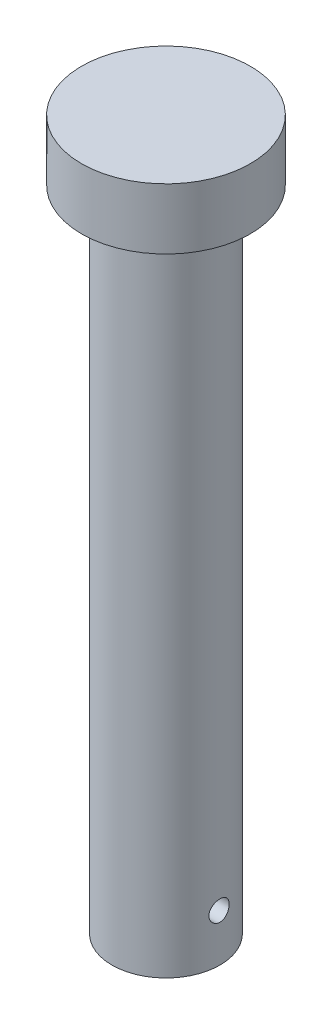
ISO-10303-21;
HEADER;
FILE_DESCRIPTION(('STEP AP214'),'2;1');
FILE_NAME('part.step','',(''),(''),'','','');
FILE_SCHEMA(('AUTOMOTIVE_DESIGN { 1 0 10303 214 1 1 1 1 }'));
ENDSEC;
DATA;
#1=APPLICATION_CONTEXT('core data for automotive mechanical design processes');
#2=APPLICATION_PROTOCOL_DEFINITION('international standard','automotive_design',2000,#1);
#3=PRODUCT_CONTEXT('',#1,'mechanical');
#4=PRODUCT('Part','Part','',(#3));
#5=PRODUCT_RELATED_PRODUCT_CATEGORY('part','',(#4));
#6=PRODUCT_DEFINITION_FORMATION('','',#4);
#7=PRODUCT_DEFINITION_CONTEXT('part definition',#1,'design');
#8=PRODUCT_DEFINITION('design','',#6,#7);
#9=PRODUCT_DEFINITION_SHAPE('','',#8);
#10=(LENGTH_UNIT() NAMED_UNIT(*) SI_UNIT(.MILLI.,.METRE.));
#11=(NAMED_UNIT(*) PLANE_ANGLE_UNIT() SI_UNIT($,.RADIAN.));
#12=(NAMED_UNIT(*) SI_UNIT($,.STERADIAN.) SOLID_ANGLE_UNIT());
#13=UNCERTAINTY_MEASURE_WITH_UNIT(LENGTH_MEASURE(1.E-05),#10,'distance_accuracy_value','');
#14=(GEOMETRIC_REPRESENTATION_CONTEXT(3) GLOBAL_UNCERTAINTY_ASSIGNED_CONTEXT((#13)) GLOBAL_UNIT_ASSIGNED_CONTEXT((#10,
#11,#12)) REPRESENTATION_CONTEXT('',''));
#15=CARTESIAN_POINT('',(0.,0.,0.));
#16=DIRECTION('',(0.,0.,1.));
#17=DIRECTION('',(1.,0.,0.));
#18=AXIS2_PLACEMENT_3D('',#15,#16,#17);
#19=CARTESIAN_POINT('',(0.,-9.,0.));
#20=DIRECTION('',(0.,1.,0.));
#21=DIRECTION('',(0.,0.,1.));
#22=AXIS2_PLACEMENT_3D('',#19,#20,#21);
#23=CYLINDRICAL_SURFACE('',#22,12.5);
#24=CARTESIAN_POINT('',(0.,-9.,0.));
#25=DIRECTION('',(0.,1.,0.));
#26=DIRECTION('',(0.,0.,1.));
#27=AXIS2_PLACEMENT_3D('',#24,#25,#26);
#28=CIRCLE('',#27,12.5);
#29=CARTESIAN_POINT('',(0.,-9.,12.5));
#30=VERTEX_POINT('',#29);
#31=EDGE_CURVE('E10',#30,#30,#28,.T.);
#32=ORIENTED_EDGE('',*,*,#31,.T.);
#33=EDGE_LOOP('',(#32));
#34=FACE_BOUND('',#33,.T.);
#35=CARTESIAN_POINT('',(0.,0.,0.));
#36=DIRECTION('',(0.,1.,0.));
#37=DIRECTION('',(0.,0.,1.));
#38=AXIS2_PLACEMENT_3D('',#35,#36,#37);
#39=CIRCLE('',#38,12.5);
#40=CARTESIAN_POINT('',(0.,0.,12.5));
#41=VERTEX_POINT('',#40);
#42=EDGE_CURVE('E49',#41,#41,#39,.T.);
#43=ORIENTED_EDGE('',*,*,#42,.F.);
#44=EDGE_LOOP('',(#43));
#45=FACE_BOUND('',#44,.T.);
#46=ADVANCED_FACE('F37',(#34,#45),#23,.T.);
#47=CARTESIAN_POINT('',(0.,-9.,0.));
#48=DIRECTION('',(0.,1.,0.));
#49=DIRECTION('',(0.,0.,1.));
#50=AXIS2_PLACEMENT_3D('',#47,#48,#49);
#51=PLANE('',#50);
#52=CARTESIAN_POINT('',(0.,-9.,0.));
#53=DIRECTION('',(0.,1.,0.));
#54=DIRECTION('',(0.,0.,1.));
#55=AXIS2_PLACEMENT_3D('',#52,#53,#54);
#56=CIRCLE('',#55,8.);
#57=CARTESIAN_POINT('',(0.,-9.,8.));
#58=VERTEX_POINT('',#57);
#59=EDGE_CURVE('E57',#58,#58,#56,.T.);
#60=ORIENTED_EDGE('',*,*,#59,.T.);
#61=EDGE_LOOP('',(#60));
#62=FACE_BOUND('',#61,.T.);
#63=ORIENTED_EDGE('',*,*,#31,.F.);
#64=EDGE_LOOP('',(#63));
#65=FACE_BOUND('',#64,.T.);
#66=ADVANCED_FACE('F83',(#62,#65),#51,.F.);
#67=CARTESIAN_POINT('',(0.,0.,0.));
#68=DIRECTION('',(0.,1.,0.));
#69=DIRECTION('',(0.,0.,1.));
#70=AXIS2_PLACEMENT_3D('',#67,#68,#69);
#71=PLANE('',#70);
#72=ORIENTED_EDGE('',*,*,#42,.T.);
#73=EDGE_LOOP('',(#72));
#74=FACE_BOUND('',#73,.T.);
#75=ADVANCED_FACE('F79',(#74),#71,.T.);
#76=CARTESIAN_POINT('',(0.,-105.,0.));
#77=DIRECTION('',(0.,1.,0.));
#78=DIRECTION('',(0.,0.,1.));
#79=AXIS2_PLACEMENT_3D('',#76,#77,#78);
#80=CYLINDRICAL_SURFACE('',#79,8.);
#81=CARTESIAN_POINT('',(-7.85811682275086,-98.,-1.5));
#82=CARTESIAN_POINT('',(-7.85811843793493,-98.0834572080117,-1.49999679883246));
#83=CARTESIAN_POINT('',(-7.85946079760266,-98.1669559482184,-1.49301126348936));
#84=CARTESIAN_POINT('',(-7.86467851014364,-98.3315989615819,-1.46527253251805));
#85=CARTESIAN_POINT('',(-7.86855601173205,-98.4127411764275,-1.44450765768477));
#86=CARTESIAN_POINT('',(-7.87838976464885,-98.5702650713709,-1.38987035617788));
#87=CARTESIAN_POINT('',(-7.88434407905997,-98.6466511093073,-1.35601013954374));
#88=CARTESIAN_POINT('',(-7.89765826320959,-98.7926535592868,-1.27617565760366));
#89=CARTESIAN_POINT('',(-7.90501802325622,-98.8622704990033,-1.23020233759194));
#90=CARTESIAN_POINT('',(-7.92041614838944,-98.9936301991991,-1.12683678942623));
#91=CARTESIAN_POINT('',(-7.92846116625679,-99.0552764834717,-1.06932292933092));
#92=CARTESIAN_POINT('',(-7.94426457664034,-99.1681043895995,-0.944771778803553));
#93=CARTESIAN_POINT('',(-7.95202295031152,-99.2192853244248,-0.877733863624945));
#94=CARTESIAN_POINT('',(-7.96645017828405,-99.3100993766005,-0.735403894570161));
#95=CARTESIAN_POINT('',(-7.97311028052363,-99.3496415335194,-0.660052840033864));
#96=CARTESIAN_POINT('',(-7.98451608632931,-99.4154695422735,-0.50363128325076));
#97=CARTESIAN_POINT('',(-7.98926194728334,-99.4417564839902,-0.422561251859501));
#98=CARTESIAN_POINT('',(-7.99625755123778,-99.4800295486111,-0.258002746187411));
#99=CARTESIAN_POINT('',(-7.99853565976327,-99.4921783059227,-0.174553323244854));
#100=CARTESIAN_POINT('',(-8.00043684615594,-99.5023368877004,-0.00677167603538327));
#101=CARTESIAN_POINT('',(-8.00006015010697,-99.500347916139,0.0775604724476688));
#102=CARTESIAN_POINT('',(-7.99671633763241,-99.4824122288528,0.243598357899395));
#103=CARTESIAN_POINT('',(-7.99378172247214,-99.46664063057,0.325323760451468));
#104=CARTESIAN_POINT('',(-7.98568826333561,-99.4218643506047,0.484947165715475));
#105=CARTESIAN_POINT('',(-7.98052933829966,-99.3928591866542,0.562845028826541));
#106=CARTESIAN_POINT('',(-7.96851260297339,-99.3222722689417,0.71311006575152));
#107=CARTESIAN_POINT('',(-7.96164537590825,-99.2806205120875,0.785443571838529));
#108=CARTESIAN_POINT('',(-7.9469714754285,-99.1859743309228,0.922159977214636));
#109=CARTESIAN_POINT('',(-7.93916470651164,-99.1329787531124,0.986542066910786));
#110=CARTESIAN_POINT('',(-7.92333513680566,-99.0161842970165,1.10656561896904));
#111=CARTESIAN_POINT('',(-7.91531085901621,-98.9522322160979,1.16205790757041));
#112=CARTESIAN_POINT('',(-7.90006508924621,-98.8158504687214,1.26155171851261));
#113=CARTESIAN_POINT('',(-7.89284360901351,-98.7434206782354,1.30555307271182));
#114=CARTESIAN_POINT('',(-7.88001893307121,-98.5919417292973,1.38085852224478));
#115=CARTESIAN_POINT('',(-7.87441850530261,-98.5128815428094,1.41214093645421));
#116=CARTESIAN_POINT('',(-7.86551242396689,-98.3504988158768,1.46093656975056));
#117=CARTESIAN_POINT('',(-7.8622065103862,-98.2671767595352,1.47845134901108));
#118=CARTESIAN_POINT('',(-7.85831520301005,-98.0999806711441,1.49899672649739));
#119=CARTESIAN_POINT('',(-7.85768955816136,-98.0161338844345,1.50224164285859));
#120=CARTESIAN_POINT('',(-7.8591219142084,-97.8490965449129,1.49472968881725));
#121=CARTESIAN_POINT('',(-7.86117978238611,-97.7659059598519,1.48397351086433));
#122=CARTESIAN_POINT('',(-7.86770980063205,-97.6032470969456,1.44894868195883));
#123=CARTESIAN_POINT('',(-7.87216186690879,-97.5237537473751,1.4247923858399));
#124=CARTESIAN_POINT('',(-7.88296134156619,-97.3699428102698,1.3637722437906));
#125=CARTESIAN_POINT('',(-7.88930888963281,-97.2956256046846,1.32690746128795));
#126=CARTESIAN_POINT('',(-7.90327577863685,-97.1533323809568,1.2410235311966));
#127=CARTESIAN_POINT('',(-7.91090895425315,-97.0854394621339,1.19186899639621));
#128=CARTESIAN_POINT('',(-7.926548113681,-96.9587879597857,1.08298344344246));
#129=CARTESIAN_POINT('',(-7.93455413096494,-96.9000301984442,1.02325147433084));
#130=CARTESIAN_POINT('',(-7.95016624005946,-96.7925162364659,0.893949417870387));
#131=CARTESIAN_POINT('',(-7.95776555833305,-96.743904173394,0.82425853409589));
#132=CARTESIAN_POINT('',(-7.97159404810351,-96.6590787938223,0.677574523040138));
#133=CARTESIAN_POINT('',(-7.97782327234725,-96.622864999975,0.600581677038528));
#134=CARTESIAN_POINT('',(-7.98818057995848,-96.5640799021359,0.441877541578683));
#135=CARTESIAN_POINT('',(-7.99231954730142,-96.5414378124386,0.360193213078986));
#136=CARTESIAN_POINT('',(-7.99807642083745,-96.5102129517101,0.19409622738157));
#137=CARTESIAN_POINT('',(-7.99969459229933,-96.5016287013373,0.109683858215853));
#138=CARTESIAN_POINT('',(-8.00022227515441,-96.4988146984815,-0.0580907602505059));
#139=CARTESIAN_POINT('',(-7.99917286625032,-96.5043672468704,-0.141449307066265));
#140=CARTESIAN_POINT('',(-7.99456866611703,-96.5291924277684,-0.306023369279197));
#141=CARTESIAN_POINT('',(-7.99101389890671,-96.5484649287442,-0.387238905213687));
#142=CARTESIAN_POINT('',(-7.98179837978045,-96.6000912073837,-0.545106475595484));
#143=CARTESIAN_POINT('',(-7.97614135981576,-96.632421812881,-0.621766319318224));
#144=CARTESIAN_POINT('',(-7.96333372068771,-96.7092204536552,-0.768605631316694));
#145=CARTESIAN_POINT('',(-7.95618300146483,-96.7536893021067,-0.838784665003269));
#146=CARTESIAN_POINT('',(-7.94104779859941,-96.8542514544423,-0.971755027780005));
#147=CARTESIAN_POINT('',(-7.93305284591272,-96.9105020338617,-1.03442623539053));
#148=CARTESIAN_POINT('',(-7.91719633538833,-97.0327045624927,-1.14951536065485));
#149=CARTESIAN_POINT('',(-7.90933480936764,-97.0986587903737,-1.2019308632478));
#150=CARTESIAN_POINT('',(-7.89455577425926,-97.2391264547033,-1.29547633945385));
#151=CARTESIAN_POINT('',(-7.88764767280728,-97.3137134396676,-1.33649740531872));
#152=CARTESIAN_POINT('',(-7.87567084650033,-97.4688257899797,-1.40536132423417));
#153=CARTESIAN_POINT('',(-7.87060038649116,-97.5493454665894,-1.43321661638912));
#154=CARTESIAN_POINT('',(-7.86393016292125,-97.6917522880659,-1.46929726596175));
#155=CARTESIAN_POINT('',(-7.86176310717932,-97.7528057237619,-1.48079105739851));
#156=CARTESIAN_POINT('',(-7.85885585595504,-97.8758984684203,-1.49614351076215));
#157=CARTESIAN_POINT('',(-7.85811562163283,-97.9379377505003,-1.50000238052127));
#158=CARTESIAN_POINT('',(-7.85811682275086,-98.,-1.5));
#159=B_SPLINE_CURVE_WITH_KNOTS('',3,(#81,#82,#83,#84,#85,#86,#87,#88,#89,#90,#91,#92,#93,#94,
#95,#96,#97,#98,#99,#100,#101,#102,#103,#104,#105,#106,#107,#108,#109,#110,#111,#112,#113,#114,
#115,#116,#117,#118,#119,#120,#121,#122,#123,#124,#125,#126,#127,#128,#129,#130,#131,#132,#133,
#134,#135,#136,#137,#138,#139,#140,#141,#142,#143,#144,#145,#146,#147,#148,#149,#150,#151,#152,
#153,#154,#155,#156,#157,#158),.UNSPECIFIED.,.T.,.F.,(4,2,2,2,2,2,2,2,2,2,2,2,2,2,2,2,2,2,2,2,2,
2,2,2,2,2,2,2,2,2,2,2,2,2,2,2,2,2,4),(0.,0.250144505793196,0.500501302380392,0.750625227978433,
1.00072963993908,1.25362335698691,1.50653367069315,1.76137104348048,2.01618745939641,
2.26804275460261,2.51987660200648,2.76855650598725,3.01724547328424,3.26733691984219,
3.51745380911786,3.77140614764065,4.02536220192401,4.27974936118266,4.53410768866487,
4.78463248587075,5.03514489338718,5.28358792315368,5.53204926624319,5.78337862654145,
6.03473059394677,6.28944125495872,6.54414210821706,6.79750269418684,7.05083661667331,
7.30029300570138,7.54974700322168,7.79876026530359,8.0477902135711,8.30038464008745,
8.55303847730766,8.80803001818119,9.0627801574912,9.24880307527214,9.43482092920426),.UNSPECIFIED.);
#160=CARTESIAN_POINT('',(-7.85811682275086,-98.,-1.5));
#161=VERTEX_POINT('',#160);
#162=EDGE_CURVE('E40',#161,#161,#159,.T.);
#163=ORIENTED_EDGE('',*,*,#162,.F.);
#164=EDGE_LOOP('',(#163));
#165=FACE_BOUND('',#164,.T.);
#166=CARTESIAN_POINT('',(7.85811682275086,-98.,-1.5));
#167=CARTESIAN_POINT('',(7.85811843793493,-97.9165427919882,-1.49999679883246));
#168=CARTESIAN_POINT('',(7.85946079760266,-97.8330440517816,-1.49301126348936));
#169=CARTESIAN_POINT('',(7.86467851014364,-97.6684010384181,-1.46527253251805));
#170=CARTESIAN_POINT('',(7.86855601173205,-97.5872588235725,-1.44450765768477));
#171=CARTESIAN_POINT('',(7.87838976464885,-97.4297349286291,-1.38987035617788));
#172=CARTESIAN_POINT('',(7.88434407905997,-97.3533488906927,-1.35601013954374));
#173=CARTESIAN_POINT('',(7.89765826320959,-97.2073464407132,-1.27617565760366));
#174=CARTESIAN_POINT('',(7.90501802325622,-97.1377295009967,-1.23020233759194));
#175=CARTESIAN_POINT('',(7.92041614838944,-97.0063698008009,-1.12683678942623));
#176=CARTESIAN_POINT('',(7.92846116625679,-96.9447235165283,-1.06932292933092));
#177=CARTESIAN_POINT('',(7.94426457664034,-96.8318956104004,-0.944771778803553));
#178=CARTESIAN_POINT('',(7.95202295031152,-96.7807146755752,-0.877733863624945));
#179=CARTESIAN_POINT('',(7.96645017828405,-96.6899006233995,-0.73540389457016));
#180=CARTESIAN_POINT('',(7.97311028052363,-96.6503584664806,-0.660052840033861));
#181=CARTESIAN_POINT('',(7.98451608632931,-96.5845304577265,-0.503631283250756));
#182=CARTESIAN_POINT('',(7.98926194728334,-96.5582435160098,-0.422561251859499));
#183=CARTESIAN_POINT('',(7.99625755123778,-96.5199704513889,-0.258002746187412));
#184=CARTESIAN_POINT('',(7.99853565976327,-96.5078216940773,-0.174553323244855));
#185=CARTESIAN_POINT('',(8.00043684615594,-96.4976631122996,-0.00677167603538377));
#186=CARTESIAN_POINT('',(8.00006015010697,-96.4996520838609,0.0775604724476685));
#187=CARTESIAN_POINT('',(7.99671633763241,-96.5175877711471,0.243598357899395));
#188=CARTESIAN_POINT('',(7.99378172247214,-96.53335936943,0.325323760451468));
#189=CARTESIAN_POINT('',(7.98568826333561,-96.5781356493952,0.484947165715475));
#190=CARTESIAN_POINT('',(7.98052933829966,-96.6071408133458,0.56284502882654));
#191=CARTESIAN_POINT('',(7.96851260297339,-96.6777277310583,0.71311006575152));
#192=CARTESIAN_POINT('',(7.96164537590825,-96.7193794879125,0.785443571838529));
#193=CARTESIAN_POINT('',(7.9469714754285,-96.8140256690771,0.922159977214636));
#194=CARTESIAN_POINT('',(7.93916470651164,-96.8670212468876,0.986542066910785));
#195=CARTESIAN_POINT('',(7.92333513680566,-96.9838157029835,1.10656561896904));
#196=CARTESIAN_POINT('',(7.91531085901621,-97.0477677839021,1.16205790757041));
#197=CARTESIAN_POINT('',(7.90006508924621,-97.1841495312786,1.2615517185126));
#198=CARTESIAN_POINT('',(7.89284360901351,-97.2565793217646,1.30555307271182));
#199=CARTESIAN_POINT('',(7.88001893307121,-97.4080582707026,1.38085852224477));
#200=CARTESIAN_POINT('',(7.87441850530261,-97.4871184571906,1.41214093645421));
#201=CARTESIAN_POINT('',(7.86551242396689,-97.6495011841232,1.46093656975056));
#202=CARTESIAN_POINT('',(7.8622065103862,-97.7328232404648,1.47845134901108));
#203=CARTESIAN_POINT('',(7.85831520301005,-97.9000193288559,1.49899672649739));
#204=CARTESIAN_POINT('',(7.85768955816136,-97.9838661155655,1.50224164285859));
#205=CARTESIAN_POINT('',(7.8591219142084,-98.1509034550871,1.49472968881725));
#206=CARTESIAN_POINT('',(7.86117978238611,-98.2340940401481,1.48397351086433));
#207=CARTESIAN_POINT('',(7.86770980063205,-98.3967529030544,1.44894868195883));
#208=CARTESIAN_POINT('',(7.87216186690879,-98.4762462526249,1.42479238583989));
#209=CARTESIAN_POINT('',(7.88296134156619,-98.6300571897302,1.36377224379059));
#210=CARTESIAN_POINT('',(7.88930888963281,-98.7043743953153,1.32690746128795));
#211=CARTESIAN_POINT('',(7.90327577863685,-98.8466676190432,1.2410235311966));
#212=CARTESIAN_POINT('',(7.91090895425315,-98.9145605378661,1.19186899639621));
#213=CARTESIAN_POINT('',(7.926548113681,-99.0412120402143,1.08298344344246));
#214=CARTESIAN_POINT('',(7.93455413096494,-99.0999698015558,1.02325147433084));
#215=CARTESIAN_POINT('',(7.95016624005946,-99.2074837635341,0.893949417870387));
#216=CARTESIAN_POINT('',(7.95776555833305,-99.256095826606,0.82425853409589));
#217=CARTESIAN_POINT('',(7.97159404810351,-99.3409212061777,0.677574523040138));
#218=CARTESIAN_POINT('',(7.97782327234725,-99.377135000025,0.600581677038528));
#219=CARTESIAN_POINT('',(7.98818057995848,-99.4359200978641,0.441877541578683));
#220=CARTESIAN_POINT('',(7.99231954730142,-99.4585621875614,0.360193213078986));
#221=CARTESIAN_POINT('',(7.99807642083745,-99.4897870482899,0.19409622738157));
#222=CARTESIAN_POINT('',(7.99969459229933,-99.4983712986627,0.109683858215853));
#223=CARTESIAN_POINT('',(8.00022227515441,-99.5011853015184,-0.0580907602505059));
#224=CARTESIAN_POINT('',(7.99917286625032,-99.4956327531295,-0.141449307066265));
#225=CARTESIAN_POINT('',(7.99456866611703,-99.4708075722316,-0.306023369279197));
#226=CARTESIAN_POINT('',(7.99101389890671,-99.4515350712558,-0.387238905213687));
#227=CARTESIAN_POINT('',(7.98179837978045,-99.3999087926163,-0.545106475595484));
#228=CARTESIAN_POINT('',(7.97614135981576,-99.367578187119,-0.621766319318224));
#229=CARTESIAN_POINT('',(7.96333372068771,-99.2907795463448,-0.768605631316694));
#230=CARTESIAN_POINT('',(7.95618300146483,-99.2463106978933,-0.838784665003269));
#231=CARTESIAN_POINT('',(7.94104779859941,-99.1457485455577,-0.971755027780005));
#232=CARTESIAN_POINT('',(7.93305284591272,-99.0894979661383,-1.03442623539053));
#233=CARTESIAN_POINT('',(7.91719633538833,-98.9672954375073,-1.14951536065485));
#234=CARTESIAN_POINT('',(7.90933480936764,-98.9013412096263,-1.2019308632478));
#235=CARTESIAN_POINT('',(7.89455577425926,-98.7608735452966,-1.29547633945385));
#236=CARTESIAN_POINT('',(7.88764767280728,-98.6862865603323,-1.33649740531872));
#237=CARTESIAN_POINT('',(7.87567084650033,-98.5311742100203,-1.40536132423417));
#238=CARTESIAN_POINT('',(7.87060038649116,-98.4506545334106,-1.43321661638912));
#239=CARTESIAN_POINT('',(7.86393016292125,-98.3082477119341,-1.46929726596175));
#240=CARTESIAN_POINT('',(7.86176310717932,-98.2471942762381,-1.48079105739851));
#241=CARTESIAN_POINT('',(7.85885585595504,-98.1241015315797,-1.49614351076215));
#242=CARTESIAN_POINT('',(7.85811562163283,-98.0620622494997,-1.50000238052127));
#243=CARTESIAN_POINT('',(7.85811682275086,-98.,-1.5));
#244=B_SPLINE_CURVE_WITH_KNOTS('',3,(#166,#167,#168,#169,#170,#171,#172,#173,#174,#175,#176,
#177,#178,#179,#180,#181,#182,#183,#184,#185,#186,#187,#188,#189,#190,#191,#192,#193,#194,#195,
#196,#197,#198,#199,#200,#201,#202,#203,#204,#205,#206,#207,#208,#209,#210,#211,#212,#213,#214,
#215,#216,#217,#218,#219,#220,#221,#222,#223,#224,#225,#226,#227,#228,#229,#230,#231,#232,#233,
#234,#235,#236,#237,#238,#239,#240,#241,#242,#243),.UNSPECIFIED.,.T.,.F.,(4,2,2,2,2,2,2,2,2,2,2,
2,2,2,2,2,2,2,2,2,2,2,2,2,2,2,2,2,2,2,2,2,2,2,2,2,2,2,4),(0.,0.250144505793196,
0.500501302380392,0.750625227978433,1.00072963993908,1.25362335698691,1.50653367069315,
1.76137104348048,2.01618745939641,2.26804275460261,2.51987660200648,2.76855650598725,
3.01724547328424,3.26733691984219,3.51745380911786,3.77140614764064,4.02536220192401,
4.27974936118266,4.53410768866487,4.78463248587074,5.03514489338718,5.2835879231537,
5.53204926624319,5.78337862654145,6.03473059394677,6.28944125495872,6.54414210821706,
6.79750269418684,7.0508366166733,7.30029300570138,7.54974700322168,7.79876026530359,
8.0477902135711,8.30038464008745,8.55303847730765,8.80803001818119,9.0627801574912,
9.24880307527214,9.43482092920426),.UNSPECIFIED.);
#245=CARTESIAN_POINT('',(7.85811682275086,-98.,-1.5));
#246=VERTEX_POINT('',#245);
#247=EDGE_CURVE('E59',#246,#246,#244,.T.);
#248=ORIENTED_EDGE('',*,*,#247,.F.);
#249=EDGE_LOOP('',(#248));
#250=FACE_BOUND('',#249,.T.);
#251=CARTESIAN_POINT('',(0.,-105.,0.));
#252=DIRECTION('',(0.,1.,0.));
#253=DIRECTION('',(0.,0.,1.));
#254=AXIS2_PLACEMENT_3D('',#251,#252,#253);
#255=CIRCLE('',#254,8.);
#256=CARTESIAN_POINT('',(0.,-105.,8.));
#257=VERTEX_POINT('',#256);
#258=EDGE_CURVE('E54',#257,#257,#255,.T.);
#259=ORIENTED_EDGE('',*,*,#258,.T.);
#260=EDGE_LOOP('',(#259));
#261=FACE_BOUND('',#260,.T.);
#262=ORIENTED_EDGE('',*,*,#59,.F.);
#263=EDGE_LOOP('',(#262));
#264=FACE_BOUND('',#263,.T.);
#265=ADVANCED_FACE('F64',(#165,#250,#261,#264),#80,.T.);
#266=CARTESIAN_POINT('',(0.,-105.,0.));
#267=DIRECTION('',(0.,1.,0.));
#268=DIRECTION('',(0.,0.,1.));
#269=AXIS2_PLACEMENT_3D('',#266,#267,#268);
#270=PLANE('',#269);
#271=ORIENTED_EDGE('',*,*,#258,.F.);
#272=EDGE_LOOP('',(#271));
#273=FACE_BOUND('',#272,.T.);
#274=ADVANCED_FACE('F71',(#273),#270,.F.);
#275=CARTESIAN_POINT('',(-18.,-98.,0.));
#276=DIRECTION('',(1.,0.,0.));
#277=DIRECTION('',(0.,0.,-1.));
#278=AXIS2_PLACEMENT_3D('',#275,#276,#277);
#279=CYLINDRICAL_SURFACE('',#278,1.5);
#280=ORIENTED_EDGE('',*,*,#162,.T.);
#281=EDGE_LOOP('',(#280));
#282=FACE_BOUND('',#281,.T.);
#283=ORIENTED_EDGE('',*,*,#247,.T.);
#284=EDGE_LOOP('',(#283));
#285=FACE_BOUND('',#284,.T.);
#286=ADVANCED_FACE('F68',(#282,#285),#279,.F.);
#287=CLOSED_SHELL('',(#46,#66,#75,#265,#274,#286));
#288=MANIFOLD_SOLID_BREP('B2',#287);
#289=ADVANCED_BREP_SHAPE_REPRESENTATION('',(#18,#288),#14);
#290=SHAPE_DEFINITION_REPRESENTATION(#9,#289);
ENDSEC;
END-ISO-10303-21;
